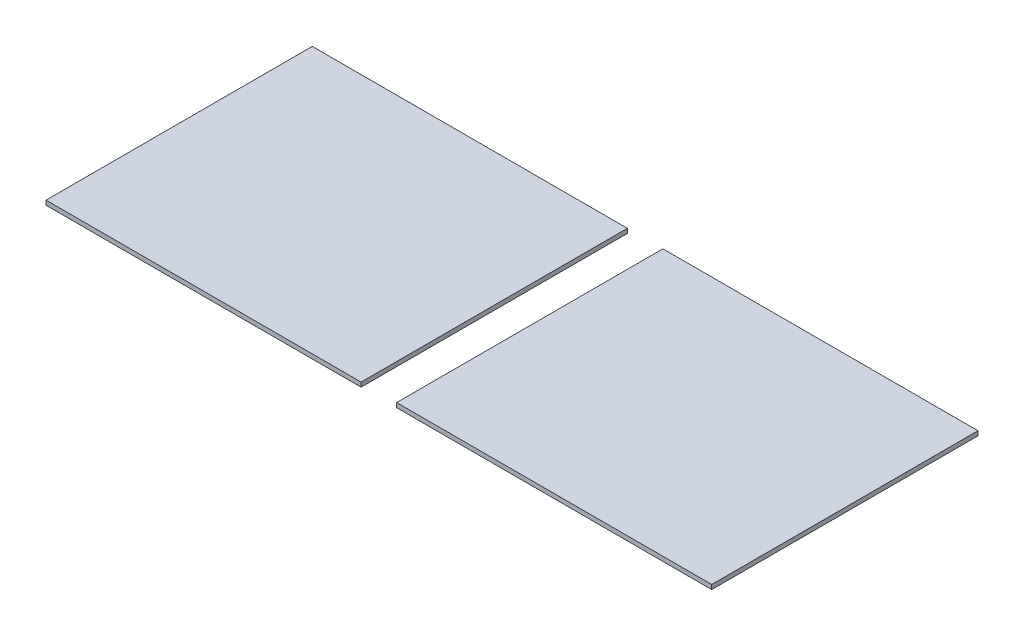
ISO-10303-21;
HEADER;
FILE_DESCRIPTION(('STEP AP214'),'2;1');
FILE_NAME('part.step','',(''),(''),'','','');
FILE_SCHEMA(('AUTOMOTIVE_DESIGN { 1 0 10303 214 1 1 1 1 }'));
ENDSEC;
DATA;
#1=APPLICATION_CONTEXT('core data for automotive mechanical design processes');
#2=APPLICATION_PROTOCOL_DEFINITION('international standard','automotive_design',2000,#1);
#3=PRODUCT_CONTEXT('',#1,'mechanical');
#4=PRODUCT('Part','Part','',(#3));
#5=PRODUCT_RELATED_PRODUCT_CATEGORY('part','',(#4));
#6=PRODUCT_DEFINITION_FORMATION('','',#4);
#7=PRODUCT_DEFINITION_CONTEXT('part definition',#1,'design');
#8=PRODUCT_DEFINITION('design','',#6,#7);
#9=PRODUCT_DEFINITION_SHAPE('','',#8);
#10=(LENGTH_UNIT() NAMED_UNIT(*) SI_UNIT(.MILLI.,.METRE.));
#11=(NAMED_UNIT(*) PLANE_ANGLE_UNIT() SI_UNIT($,.RADIAN.));
#12=(NAMED_UNIT(*) SI_UNIT($,.STERADIAN.) SOLID_ANGLE_UNIT());
#13=UNCERTAINTY_MEASURE_WITH_UNIT(LENGTH_MEASURE(1.E-05),#10,'distance_accuracy_value','');
#14=(GEOMETRIC_REPRESENTATION_CONTEXT(3) GLOBAL_UNCERTAINTY_ASSIGNED_CONTEXT((#13)) GLOBAL_UNIT_ASSIGNED_CONTEXT((#10,
#11,#12)) REPRESENTATION_CONTEXT('',''));
#15=CARTESIAN_POINT('',(0.,0.,0.));
#16=DIRECTION('',(0.,0.,1.));
#17=DIRECTION('',(1.,0.,0.));
#18=AXIS2_PLACEMENT_3D('',#15,#16,#17);
#19=CARTESIAN_POINT('',(0.,6.35,0.));
#20=DIRECTION('',(0.,0.,-1.));
#21=DIRECTION('',(-1.,0.,0.));
#22=AXIS2_PLACEMENT_3D('',#19,#20,#21);
#23=PLANE('',#22);
#24=DIRECTION('',(1.,0.,0.));
#25=VECTOR('',#24,1.);
#26=CARTESIAN_POINT('',(0.,0.,0.));
#27=LINE('',#26,#25);
#28=CARTESIAN_POINT('',(501.65,0.,0.));
#29=VERTEX_POINT('',#28);
#30=CARTESIAN_POINT('',(952.5,0.,0.));
#31=VERTEX_POINT('',#30);
#32=EDGE_CURVE('E64',#29,#31,#27,.T.);
#33=ORIENTED_EDGE('',*,*,#32,.T.);
#34=DIRECTION('',(0.,1.,0.));
#35=VECTOR('',#34,1.);
#36=CARTESIAN_POINT('',(952.5,-0.00100000000000013,0.));
#37=LINE('',#36,#35);
#38=CARTESIAN_POINT('',(952.5,6.35,0.));
#39=VERTEX_POINT('',#38);
#40=EDGE_CURVE('E100',#31,#39,#37,.T.);
#41=ORIENTED_EDGE('',*,*,#40,.T.);
#42=DIRECTION('',(1.,0.,0.));
#43=VECTOR('',#42,1.);
#44=CARTESIAN_POINT('',(0.,6.35,0.));
#45=LINE('',#44,#43);
#46=CARTESIAN_POINT('',(501.65,6.35,0.));
#47=VERTEX_POINT('',#46);
#48=EDGE_CURVE('E111',#47,#39,#45,.T.);
#49=ORIENTED_EDGE('',*,*,#48,.F.);
#50=DIRECTION('',(0.,1.,0.));
#51=VECTOR('',#50,1.);
#52=CARTESIAN_POINT('',(501.65,-0.00100000000000013,0.));
#53=LINE('',#52,#51);
#54=EDGE_CURVE('E69',#29,#47,#53,.T.);
#55=ORIENTED_EDGE('',*,*,#54,.F.);
#56=EDGE_LOOP('',(#33,#41,#49,#55));
#57=FACE_BOUND('',#56,.T.);
#58=ADVANCED_FACE('F61',(#57),#23,.F.);
#59=CARTESIAN_POINT('',(0.,6.35,0.));
#60=DIRECTION('',(0.,-1.,0.));
#61=DIRECTION('',(0.,0.,-1.));
#62=AXIS2_PLACEMENT_3D('',#59,#60,#61);
#63=PLANE('',#62);
#64=ORIENTED_EDGE('',*,*,#48,.T.);
#65=DIRECTION('',(0.,0.,1.));
#66=VECTOR('',#65,1.);
#67=CARTESIAN_POINT('',(952.5,6.35,-381.));
#68=LINE('',#67,#66);
#69=CARTESIAN_POINT('',(952.5,6.35,-381.));
#70=VERTEX_POINT('',#69);
#71=EDGE_CURVE('E106',#70,#39,#68,.T.);
#72=ORIENTED_EDGE('',*,*,#71,.F.);
#73=DIRECTION('',(1.,0.,0.));
#74=VECTOR('',#73,1.);
#75=CARTESIAN_POINT('',(501.65,6.35,-381.));
#76=LINE('',#75,#74);
#77=CARTESIAN_POINT('',(501.65,6.35,-381.));
#78=VERTEX_POINT('',#77);
#79=EDGE_CURVE('E120',#78,#70,#76,.T.);
#80=ORIENTED_EDGE('',*,*,#79,.F.);
#81=DIRECTION('',(0.,0.,-1.));
#82=VECTOR('',#81,1.);
#83=CARTESIAN_POINT('',(501.65,6.35,-381.));
#84=LINE('',#83,#82);
#85=EDGE_CURVE('E12',#47,#78,#84,.T.);
#86=ORIENTED_EDGE('',*,*,#85,.F.);
#87=EDGE_LOOP('',(#64,#72,#80,#86));
#88=FACE_BOUND('',#87,.T.);
#89=ADVANCED_FACE('F131',(#88),#63,.F.);
#90=CARTESIAN_POINT('',(0.,0.,0.));
#91=DIRECTION('',(0.,-1.,0.));
#92=DIRECTION('',(0.,0.,-1.));
#93=AXIS2_PLACEMENT_3D('',#90,#91,#92);
#94=PLANE('',#93);
#95=DIRECTION('',(0.,0.,1.));
#96=VECTOR('',#95,1.);
#97=CARTESIAN_POINT('',(952.5,0.,-381.));
#98=LINE('',#97,#96);
#99=CARTESIAN_POINT('',(952.5,0.,-381.));
#100=VERTEX_POINT('',#99);
#101=EDGE_CURVE('E103',#100,#31,#98,.T.);
#102=ORIENTED_EDGE('',*,*,#101,.T.);
#103=ORIENTED_EDGE('',*,*,#32,.F.);
#104=DIRECTION('',(0.,0.,-1.));
#105=VECTOR('',#104,1.);
#106=CARTESIAN_POINT('',(501.65,0.,-381.));
#107=LINE('',#106,#105);
#108=CARTESIAN_POINT('',(501.65,0.,-381.));
#109=VERTEX_POINT('',#108);
#110=EDGE_CURVE('E77',#29,#109,#107,.T.);
#111=ORIENTED_EDGE('',*,*,#110,.T.);
#112=DIRECTION('',(1.,0.,0.));
#113=VECTOR('',#112,1.);
#114=CARTESIAN_POINT('',(501.65,0.,-381.));
#115=LINE('',#114,#113);
#116=EDGE_CURVE('E117',#109,#100,#115,.T.);
#117=ORIENTED_EDGE('',*,*,#116,.T.);
#118=EDGE_LOOP('',(#102,#103,#111,#117));
#119=FACE_BOUND('',#118,.T.);
#120=ADVANCED_FACE('F116',(#119),#94,.T.);
#121=CARTESIAN_POINT('',(952.5,-0.00100000000000013,-381.));
#122=DIRECTION('',(-1.,0.,0.));
#123=DIRECTION('',(0.,0.,1.));
#124=AXIS2_PLACEMENT_3D('',#121,#122,#123);
#125=PLANE('',#124);
#126=DIRECTION('',(0.,1.,0.));
#127=VECTOR('',#126,1.);
#128=CARTESIAN_POINT('',(952.5,-0.00100000000000013,-381.));
#129=LINE('',#128,#127);
#130=EDGE_CURVE('E126',#100,#70,#129,.T.);
#131=ORIENTED_EDGE('',*,*,#130,.T.);
#132=ORIENTED_EDGE('',*,*,#71,.T.);
#133=ORIENTED_EDGE('',*,*,#40,.F.);
#134=ORIENTED_EDGE('',*,*,#101,.F.);
#135=EDGE_LOOP('',(#131,#132,#133,#134));
#136=FACE_BOUND('',#135,.T.);
#137=ADVANCED_FACE('F102',(#136),#125,.F.);
#138=CARTESIAN_POINT('',(501.65,-0.00100000000000013,-381.));
#139=DIRECTION('',(0.,0.,1.));
#140=DIRECTION('',(1.,0.,0.));
#141=AXIS2_PLACEMENT_3D('',#138,#139,#140);
#142=PLANE('',#141);
#143=DIRECTION('',(0.,1.,0.));
#144=VECTOR('',#143,1.);
#145=CARTESIAN_POINT('',(501.65,-0.00100000000000013,-381.));
#146=LINE('',#145,#144);
#147=EDGE_CURVE('E82',#109,#78,#146,.T.);
#148=ORIENTED_EDGE('',*,*,#147,.T.);
#149=ORIENTED_EDGE('',*,*,#79,.T.);
#150=ORIENTED_EDGE('',*,*,#130,.F.);
#151=ORIENTED_EDGE('',*,*,#116,.F.);
#152=EDGE_LOOP('',(#148,#149,#150,#151));
#153=FACE_BOUND('',#152,.T.);
#154=ADVANCED_FACE('F135',(#153),#142,.F.);
#155=CARTESIAN_POINT('',(501.65,-0.00100000000000013,-381.));
#156=DIRECTION('',(1.,0.,0.));
#157=DIRECTION('',(0.,0.,-1.));
#158=AXIS2_PLACEMENT_3D('',#155,#156,#157);
#159=PLANE('',#158);
#160=ORIENTED_EDGE('',*,*,#54,.T.);
#161=ORIENTED_EDGE('',*,*,#85,.T.);
#162=ORIENTED_EDGE('',*,*,#147,.F.);
#163=ORIENTED_EDGE('',*,*,#110,.F.);
#164=EDGE_LOOP('',(#160,#161,#162,#163));
#165=FACE_BOUND('',#164,.T.);
#166=ADVANCED_FACE('F133',(#165),#159,.F.);
#167=CLOSED_SHELL('',(#58,#89,#120,#137,#154,#166));
#168=MANIFOLD_SOLID_BREP('B2',#167);
#169=CARTESIAN_POINT('',(0.,6.35,0.));
#170=DIRECTION('',(0.,-1.,0.));
#171=DIRECTION('',(0.,0.,-1.));
#172=AXIS2_PLACEMENT_3D('',#169,#170,#171);
#173=PLANE('',#172);
#174=DIRECTION('',(1.,0.,0.));
#175=VECTOR('',#174,1.);
#176=CARTESIAN_POINT('',(0.,6.35,0.));
#177=LINE('',#176,#175);
#178=CARTESIAN_POINT('',(0.,6.35,0.));
#179=VERTEX_POINT('',#178);
#180=CARTESIAN_POINT('',(450.85,6.35,0.));
#181=VERTEX_POINT('',#180);
#182=EDGE_CURVE('E196',#179,#181,#177,.T.);
#183=ORIENTED_EDGE('',*,*,#182,.T.);
#184=DIRECTION('',(0.,0.,1.));
#185=VECTOR('',#184,1.);
#186=CARTESIAN_POINT('',(450.85,6.35,-381.));
#187=LINE('',#186,#185);
#188=CARTESIAN_POINT('',(450.85,6.35,-381.));
#189=VERTEX_POINT('',#188);
#190=EDGE_CURVE('E236',#189,#181,#187,.T.);
#191=ORIENTED_EDGE('',*,*,#190,.F.);
#192=DIRECTION('',(1.,0.,0.));
#193=VECTOR('',#192,1.);
#194=CARTESIAN_POINT('',(0.,6.35,-381.));
#195=LINE('',#194,#193);
#196=CARTESIAN_POINT('',(0.,6.35,-381.));
#197=VERTEX_POINT('',#196);
#198=EDGE_CURVE('E248',#197,#189,#195,.T.);
#199=ORIENTED_EDGE('',*,*,#198,.F.);
#200=DIRECTION('',(0.,0.,1.));
#201=VECTOR('',#200,1.);
#202=CARTESIAN_POINT('',(0.,6.35,0.));
#203=LINE('',#202,#201);
#204=EDGE_CURVE('E212',#197,#179,#203,.T.);
#205=ORIENTED_EDGE('',*,*,#204,.T.);
#206=EDGE_LOOP('',(#183,#191,#199,#205));
#207=FACE_BOUND('',#206,.T.);
#208=ADVANCED_FACE('F187',(#207),#173,.F.);
#209=CARTESIAN_POINT('',(0.,0.,0.));
#210=DIRECTION('',(0.,-1.,0.));
#211=DIRECTION('',(0.,0.,-1.));
#212=AXIS2_PLACEMENT_3D('',#209,#210,#211);
#213=PLANE('',#212);
#214=DIRECTION('',(0.,0.,1.));
#215=VECTOR('',#214,1.);
#216=CARTESIAN_POINT('',(450.85,0.,-381.));
#217=LINE('',#216,#215);
#218=CARTESIAN_POINT('',(450.85,0.,-381.));
#219=VERTEX_POINT('',#218);
#220=CARTESIAN_POINT('',(450.85,0.,0.));
#221=VERTEX_POINT('',#220);
#222=EDGE_CURVE('E233',#219,#221,#217,.T.);
#223=ORIENTED_EDGE('',*,*,#222,.T.);
#224=DIRECTION('',(1.,0.,0.));
#225=VECTOR('',#224,1.);
#226=CARTESIAN_POINT('',(0.,0.,0.));
#227=LINE('',#226,#225);
#228=CARTESIAN_POINT('',(0.,0.,0.));
#229=VERTEX_POINT('',#228);
#230=EDGE_CURVE('E246',#229,#221,#227,.T.);
#231=ORIENTED_EDGE('',*,*,#230,.F.);
#232=DIRECTION('',(0.,0.,1.));
#233=VECTOR('',#232,1.);
#234=CARTESIAN_POINT('',(0.,0.,0.));
#235=LINE('',#234,#233);
#236=CARTESIAN_POINT('',(0.,0.,-381.));
#237=VERTEX_POINT('',#236);
#238=EDGE_CURVE('E253',#237,#229,#235,.T.);
#239=ORIENTED_EDGE('',*,*,#238,.F.);
#240=DIRECTION('',(1.,0.,0.));
#241=VECTOR('',#240,1.);
#242=CARTESIAN_POINT('',(0.,0.,-381.));
#243=LINE('',#242,#241);
#244=EDGE_CURVE('E240',#237,#219,#243,.T.);
#245=ORIENTED_EDGE('',*,*,#244,.T.);
#246=EDGE_LOOP('',(#223,#231,#239,#245));
#247=FACE_BOUND('',#246,.T.);
#248=ADVANCED_FACE('F244',(#247),#213,.T.);
#249=CARTESIAN_POINT('',(0.,6.35,0.));
#250=DIRECTION('',(0.,0.,-1.));
#251=DIRECTION('',(-1.,0.,0.));
#252=AXIS2_PLACEMENT_3D('',#249,#250,#251);
#253=PLANE('',#252);
#254=ORIENTED_EDGE('',*,*,#230,.T.);
#255=DIRECTION('',(0.,1.,0.));
#256=VECTOR('',#255,1.);
#257=CARTESIAN_POINT('',(450.85,-0.00100000000000013,0.));
#258=LINE('',#257,#256);
#259=EDGE_CURVE('E230',#221,#181,#258,.T.);
#260=ORIENTED_EDGE('',*,*,#259,.T.);
#261=ORIENTED_EDGE('',*,*,#182,.F.);
#262=DIRECTION('',(0.,-1.,0.));
#263=VECTOR('',#262,1.);
#264=CARTESIAN_POINT('',(0.,6.35,0.));
#265=LINE('',#264,#263);
#266=EDGE_CURVE('E59',#179,#229,#265,.T.);
#267=ORIENTED_EDGE('',*,*,#266,.T.);
#268=EDGE_LOOP('',(#254,#260,#261,#267));
#269=FACE_BOUND('',#268,.T.);
#270=ADVANCED_FACE('F250',(#269),#253,.F.);
#271=CARTESIAN_POINT('',(0.,6.35,0.));
#272=DIRECTION('',(1.,0.,0.));
#273=DIRECTION('',(0.,0.,-1.));
#274=AXIS2_PLACEMENT_3D('',#271,#272,#273);
#275=PLANE('',#274);
#276=ORIENTED_EDGE('',*,*,#204,.F.);
#277=DIRECTION('',(0.,1.,0.));
#278=VECTOR('',#277,1.);
#279=CARTESIAN_POINT('',(0.,-0.00100000000000013,-381.));
#280=LINE('',#279,#278);
#281=EDGE_CURVE('E263',#237,#197,#280,.T.);
#282=ORIENTED_EDGE('',*,*,#281,.F.);
#283=ORIENTED_EDGE('',*,*,#238,.T.);
#284=ORIENTED_EDGE('',*,*,#266,.F.);
#285=EDGE_LOOP('',(#276,#282,#283,#284));
#286=FACE_BOUND('',#285,.T.);
#287=ADVANCED_FACE('F189',(#286),#275,.F.);
#288=CARTESIAN_POINT('',(0.,-0.00100000000000013,-381.));
#289=DIRECTION('',(0.,0.,1.));
#290=DIRECTION('',(1.,0.,0.));
#291=AXIS2_PLACEMENT_3D('',#288,#289,#290);
#292=PLANE('',#291);
#293=ORIENTED_EDGE('',*,*,#281,.T.);
#294=ORIENTED_EDGE('',*,*,#198,.T.);
#295=DIRECTION('',(0.,1.,0.));
#296=VECTOR('',#295,1.);
#297=CARTESIAN_POINT('',(450.85,-0.00100000000000013,-381.));
#298=LINE('',#297,#296);
#299=EDGE_CURVE('E203',#219,#189,#298,.T.);
#300=ORIENTED_EDGE('',*,*,#299,.F.);
#301=ORIENTED_EDGE('',*,*,#244,.F.);
#302=EDGE_LOOP('',(#293,#294,#300,#301));
#303=FACE_BOUND('',#302,.T.);
#304=ADVANCED_FACE('F271',(#303),#292,.F.);
#305=CARTESIAN_POINT('',(450.85,-0.00100000000000013,-381.));
#306=DIRECTION('',(-1.,0.,0.));
#307=DIRECTION('',(0.,0.,1.));
#308=AXIS2_PLACEMENT_3D('',#305,#306,#307);
#309=PLANE('',#308);
#310=ORIENTED_EDGE('',*,*,#299,.T.);
#311=ORIENTED_EDGE('',*,*,#190,.T.);
#312=ORIENTED_EDGE('',*,*,#259,.F.);
#313=ORIENTED_EDGE('',*,*,#222,.F.);
#314=EDGE_LOOP('',(#310,#311,#312,#313));
#315=FACE_BOUND('',#314,.T.);
#316=ADVANCED_FACE('F232',(#315),#309,.F.);
#317=CLOSED_SHELL('',(#208,#248,#270,#287,#304,#316));
#318=MANIFOLD_SOLID_BREP('B6',#317);
#319=ADVANCED_BREP_SHAPE_REPRESENTATION('',(#18,#168,#318),#14);
#320=SHAPE_DEFINITION_REPRESENTATION(#9,#319);
ENDSEC;
END-ISO-10303-21;
